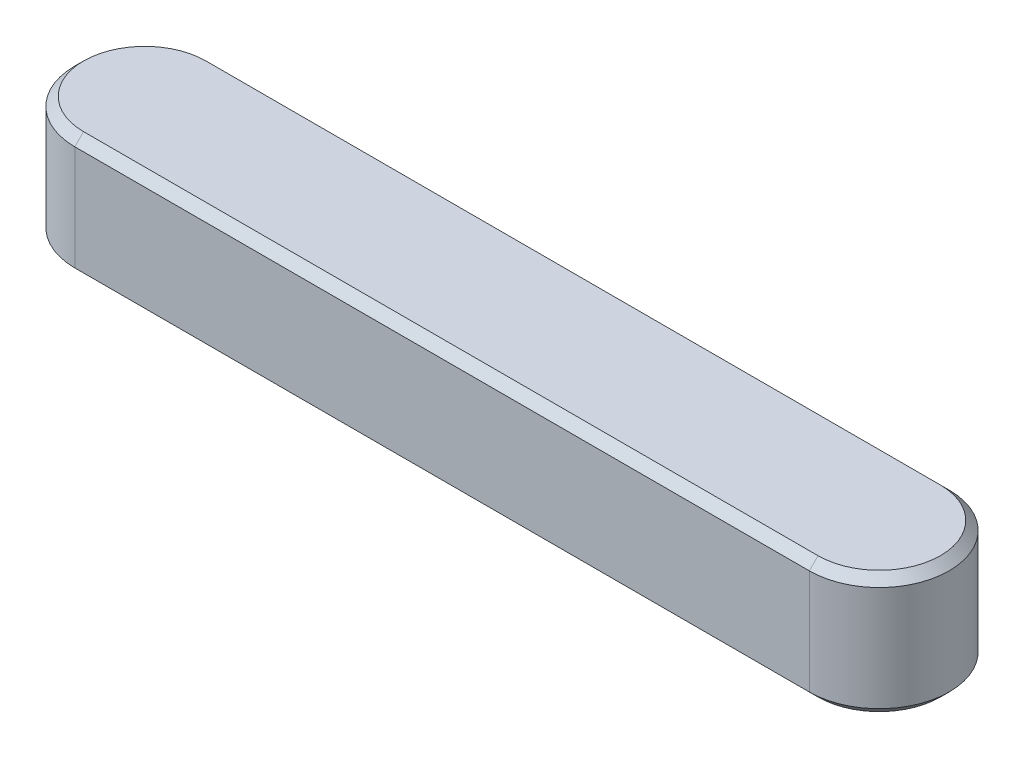
ISO-10303-21;
HEADER;
FILE_DESCRIPTION(('STEP AP214'),'2;1');
FILE_NAME('part.step','',(''),(''),'','','');
FILE_SCHEMA(('AUTOMOTIVE_DESIGN { 1 0 10303 214 1 1 1 1 }'));
ENDSEC;
DATA;
#1=APPLICATION_CONTEXT('core data for automotive mechanical design processes');
#2=APPLICATION_PROTOCOL_DEFINITION('international standard','automotive_design',2000,#1);
#3=PRODUCT_CONTEXT('',#1,'mechanical');
#4=PRODUCT('Part','Part','',(#3));
#5=PRODUCT_RELATED_PRODUCT_CATEGORY('part','',(#4));
#6=PRODUCT_DEFINITION_FORMATION('','',#4);
#7=PRODUCT_DEFINITION_CONTEXT('part definition',#1,'design');
#8=PRODUCT_DEFINITION('design','',#6,#7);
#9=PRODUCT_DEFINITION_SHAPE('','',#8);
#10=(LENGTH_UNIT() NAMED_UNIT(*) SI_UNIT(.MILLI.,.METRE.));
#11=(NAMED_UNIT(*) PLANE_ANGLE_UNIT() SI_UNIT($,.RADIAN.));
#12=(NAMED_UNIT(*) SI_UNIT($,.STERADIAN.) SOLID_ANGLE_UNIT());
#13=UNCERTAINTY_MEASURE_WITH_UNIT(LENGTH_MEASURE(1.E-05),#10,'distance_accuracy_value','');
#14=(GEOMETRIC_REPRESENTATION_CONTEXT(3) GLOBAL_UNCERTAINTY_ASSIGNED_CONTEXT((#13)) GLOBAL_UNIT_ASSIGNED_CONTEXT((#10,
#11,#12)) REPRESENTATION_CONTEXT('',''));
#15=CARTESIAN_POINT('',(0.,0.,0.));
#16=DIRECTION('',(0.,0.,1.));
#17=DIRECTION('',(1.,0.,0.));
#18=AXIS2_PLACEMENT_3D('',#15,#16,#17);
#19=CARTESIAN_POINT('',(-21.,7.,0.));
#20=DIRECTION('',(0.,-1.,0.));
#21=DIRECTION('',(0.,0.,-1.));
#22=AXIS2_PLACEMENT_3D('',#19,#20,#21);
#23=CYLINDRICAL_SURFACE('',#22,4.);
#24=DIRECTION('',(0.,-1.,0.));
#25=VECTOR('',#24,1.);
#26=CARTESIAN_POINT('',(-21.,7.,4.));
#27=LINE('',#26,#25);
#28=CARTESIAN_POINT('',(-21.,6.49999999999999,4.));
#29=VERTEX_POINT('',#28);
#30=CARTESIAN_POINT('',(-21.,0.49999999999999,4.));
#31=VERTEX_POINT('',#30);
#32=EDGE_CURVE('E127',#29,#31,#27,.T.);
#33=ORIENTED_EDGE('',*,*,#32,.F.);
#34=CARTESIAN_POINT('',(-21.,6.49999999999999,0.));
#35=DIRECTION('',(0.,1.,0.));
#36=DIRECTION('',(0.,0.,1.));
#37=AXIS2_PLACEMENT_3D('',#34,#35,#36);
#38=CIRCLE('',#37,4.);
#39=CARTESIAN_POINT('',(-21.,6.49999999999999,-4.));
#40=VERTEX_POINT('',#39);
#41=EDGE_CURVE('E151',#29,#40,#38,.F.);
#42=ORIENTED_EDGE('',*,*,#41,.T.);
#43=DIRECTION('',(0.,-1.,0.));
#44=VECTOR('',#43,1.);
#45=CARTESIAN_POINT('',(-21.,7.,-4.));
#46=LINE('',#45,#44);
#47=CARTESIAN_POINT('',(-21.,0.49999999999999,-4.));
#48=VERTEX_POINT('',#47);
#49=EDGE_CURVE('E162',#40,#48,#46,.T.);
#50=ORIENTED_EDGE('',*,*,#49,.T.);
#51=CARTESIAN_POINT('',(-21.,0.49999999999999,0.));
#52=DIRECTION('',(0.,1.,0.));
#53=DIRECTION('',(0.,0.,1.));
#54=AXIS2_PLACEMENT_3D('',#51,#52,#53);
#55=CIRCLE('',#54,4.);
#56=EDGE_CURVE('E149',#48,#31,#55,.T.);
#57=ORIENTED_EDGE('',*,*,#56,.T.);
#58=EDGE_LOOP('',(#33,#42,#50,#57));
#59=FACE_BOUND('',#58,.T.);
#60=ADVANCED_FACE('F41',(#59),#23,.T.);
#61=CARTESIAN_POINT('',(-21.,7.,4.));
#62=DIRECTION('',(0.,0.,-1.));
#63=DIRECTION('',(-1.,0.,0.));
#64=AXIS2_PLACEMENT_3D('',#61,#62,#63);
#65=PLANE('',#64);
#66=DIRECTION('',(0.,-1.,0.));
#67=VECTOR('',#66,1.);
#68=CARTESIAN_POINT('',(21.,7.,4.));
#69=LINE('',#68,#67);
#70=CARTESIAN_POINT('',(21.,6.49999999999999,4.));
#71=VERTEX_POINT('',#70);
#72=CARTESIAN_POINT('',(21.,0.49999999999999,4.));
#73=VERTEX_POINT('',#72);
#74=EDGE_CURVE('E314',#71,#73,#69,.T.);
#75=ORIENTED_EDGE('',*,*,#74,.F.);
#76=DIRECTION('',(-1.,0.,0.));
#77=VECTOR('',#76,1.);
#78=CARTESIAN_POINT('',(-21.,6.49999999999999,4.));
#79=LINE('',#78,#77);
#80=EDGE_CURVE('E147',#71,#29,#79,.T.);
#81=ORIENTED_EDGE('',*,*,#80,.T.);
#82=ORIENTED_EDGE('',*,*,#32,.T.);
#83=DIRECTION('',(1.,0.,0.));
#84=VECTOR('',#83,1.);
#85=CARTESIAN_POINT('',(-21.,0.49999999999999,4.));
#86=LINE('',#85,#84);
#87=EDGE_CURVE('E144',#31,#73,#86,.T.);
#88=ORIENTED_EDGE('',*,*,#87,.T.);
#89=EDGE_LOOP('',(#75,#81,#82,#88));
#90=FACE_BOUND('',#89,.T.);
#91=ADVANCED_FACE('F199',(#90),#65,.F.);
#92=CARTESIAN_POINT('',(21.,7.,0.));
#93=DIRECTION('',(0.,-1.,0.));
#94=DIRECTION('',(0.,0.,-1.));
#95=AXIS2_PLACEMENT_3D('',#92,#93,#94);
#96=CYLINDRICAL_SURFACE('',#95,4.);
#97=DIRECTION('',(0.,-1.,0.));
#98=VECTOR('',#97,1.);
#99=CARTESIAN_POINT('',(21.,7.,-4.00000000000001));
#100=LINE('',#99,#98);
#101=CARTESIAN_POINT('',(21.,6.49999999999999,-4.00000000000001));
#102=VERTEX_POINT('',#101);
#103=CARTESIAN_POINT('',(21.,0.49999999999999,-4.00000000000001));
#104=VERTEX_POINT('',#103);
#105=EDGE_CURVE('E310',#102,#104,#100,.T.);
#106=ORIENTED_EDGE('',*,*,#105,.F.);
#107=CARTESIAN_POINT('',(21.,6.49999999999999,0.));
#108=DIRECTION('',(0.,1.,0.));
#109=DIRECTION('',(0.,0.,1.));
#110=AXIS2_PLACEMENT_3D('',#107,#108,#109);
#111=CIRCLE('',#110,4.);
#112=EDGE_CURVE('E142',#102,#71,#111,.F.);
#113=ORIENTED_EDGE('',*,*,#112,.T.);
#114=ORIENTED_EDGE('',*,*,#74,.T.);
#115=CARTESIAN_POINT('',(21.,0.49999999999999,0.));
#116=DIRECTION('',(0.,1.,0.));
#117=DIRECTION('',(0.,0.,1.));
#118=AXIS2_PLACEMENT_3D('',#115,#116,#117);
#119=CIRCLE('',#118,4.);
#120=EDGE_CURVE('E140',#73,#104,#119,.T.);
#121=ORIENTED_EDGE('',*,*,#120,.T.);
#122=EDGE_LOOP('',(#106,#113,#114,#121));
#123=FACE_BOUND('',#122,.T.);
#124=ADVANCED_FACE('F205',(#123),#96,.T.);
#125=CARTESIAN_POINT('',(-21.,7.,-4.));
#126=DIRECTION('',(0.,0.,1.));
#127=DIRECTION('',(1.,0.,0.));
#128=AXIS2_PLACEMENT_3D('',#125,#126,#127);
#129=PLANE('',#128);
#130=ORIENTED_EDGE('',*,*,#49,.F.);
#131=DIRECTION('',(1.,0.,0.));
#132=VECTOR('',#131,1.);
#133=CARTESIAN_POINT('',(21.,6.49999999999999,-4.00000000000001));
#134=LINE('',#133,#132);
#135=EDGE_CURVE('E114',#40,#102,#134,.T.);
#136=ORIENTED_EDGE('',*,*,#135,.T.);
#137=ORIENTED_EDGE('',*,*,#105,.T.);
#138=DIRECTION('',(-1.,0.,0.));
#139=VECTOR('',#138,1.);
#140=CARTESIAN_POINT('',(-21.,0.49999999999999,-4.));
#141=LINE('',#140,#139);
#142=EDGE_CURVE('E133',#104,#48,#141,.T.);
#143=ORIENTED_EDGE('',*,*,#142,.T.);
#144=EDGE_LOOP('',(#130,#136,#137,#143));
#145=FACE_BOUND('',#144,.T.);
#146=ADVANCED_FACE('F195',(#145),#129,.F.);
#147=CARTESIAN_POINT('',(-21.,7.,0.));
#148=DIRECTION('',(0.,1.,0.));
#149=DIRECTION('',(0.,0.,1.));
#150=AXIS2_PLACEMENT_3D('',#147,#148,#149);
#151=PLANE('',#150);
#152=CARTESIAN_POINT('',(21.,7.,0.));
#153=DIRECTION('',(0.,1.,0.));
#154=DIRECTION('',(0.,0.,1.));
#155=AXIS2_PLACEMENT_3D('',#152,#153,#154);
#156=CIRCLE('',#155,3.5);
#157=CARTESIAN_POINT('',(21.,7.,3.49999999999999));
#158=VERTEX_POINT('',#157);
#159=CARTESIAN_POINT('',(21.,7.,-3.5));
#160=VERTEX_POINT('',#159);
#161=EDGE_CURVE('E131',#158,#160,#156,.T.);
#162=ORIENTED_EDGE('',*,*,#161,.T.);
#163=DIRECTION('',(-1.,0.,0.));
#164=VECTOR('',#163,1.);
#165=CARTESIAN_POINT('',(-21.,7.,-3.5));
#166=LINE('',#165,#164);
#167=CARTESIAN_POINT('',(-21.,7.,-3.49999999999999));
#168=VERTEX_POINT('',#167);
#169=EDGE_CURVE('E112',#160,#168,#166,.T.);
#170=ORIENTED_EDGE('',*,*,#169,.T.);
#171=CARTESIAN_POINT('',(-21.,7.,0.));
#172=DIRECTION('',(0.,1.,0.));
#173=DIRECTION('',(0.,0.,1.));
#174=AXIS2_PLACEMENT_3D('',#171,#172,#173);
#175=CIRCLE('',#174,3.5);
#176=CARTESIAN_POINT('',(-21.,7.,3.5));
#177=VERTEX_POINT('',#176);
#178=EDGE_CURVE('E120',#168,#177,#175,.T.);
#179=ORIENTED_EDGE('',*,*,#178,.T.);
#180=DIRECTION('',(1.,0.,0.));
#181=VECTOR('',#180,1.);
#182=CARTESIAN_POINT('',(21.,7.,3.49999999999999));
#183=LINE('',#182,#181);
#184=EDGE_CURVE('E126',#177,#158,#183,.T.);
#185=ORIENTED_EDGE('',*,*,#184,.T.);
#186=EDGE_LOOP('',(#162,#170,#179,#185));
#187=FACE_BOUND('',#186,.T.);
#188=ADVANCED_FACE('F129',(#187),#151,.T.);
#189=CARTESIAN_POINT('',(-21.,0.,0.));
#190=DIRECTION('',(0.,1.,0.));
#191=DIRECTION('',(0.,0.,1.));
#192=AXIS2_PLACEMENT_3D('',#189,#190,#191);
#193=PLANE('',#192);
#194=CARTESIAN_POINT('',(21.,0.,0.));
#195=DIRECTION('',(0.,1.,0.));
#196=DIRECTION('',(0.,0.,1.));
#197=AXIS2_PLACEMENT_3D('',#194,#195,#196);
#198=CIRCLE('',#197,3.5);
#199=CARTESIAN_POINT('',(21.,0.,-3.50000000000001));
#200=VERTEX_POINT('',#199);
#201=CARTESIAN_POINT('',(21.,0.,3.5));
#202=VERTEX_POINT('',#201);
#203=EDGE_CURVE('E51',#200,#202,#198,.F.);
#204=ORIENTED_EDGE('',*,*,#203,.T.);
#205=DIRECTION('',(-1.,0.,0.));
#206=VECTOR('',#205,1.);
#207=CARTESIAN_POINT('',(-21.,0.,3.5));
#208=LINE('',#207,#206);
#209=CARTESIAN_POINT('',(-21.,0.,3.50000000000001));
#210=VERTEX_POINT('',#209);
#211=EDGE_CURVE('E11',#202,#210,#208,.T.);
#212=ORIENTED_EDGE('',*,*,#211,.T.);
#213=CARTESIAN_POINT('',(-21.,0.,0.));
#214=DIRECTION('',(0.,1.,0.));
#215=DIRECTION('',(0.,0.,1.));
#216=AXIS2_PLACEMENT_3D('',#213,#214,#215);
#217=CIRCLE('',#216,3.5);
#218=CARTESIAN_POINT('',(-21.,0.,-3.5));
#219=VERTEX_POINT('',#218);
#220=EDGE_CURVE('E153',#210,#219,#217,.F.);
#221=ORIENTED_EDGE('',*,*,#220,.T.);
#222=DIRECTION('',(1.,0.,0.));
#223=VECTOR('',#222,1.);
#224=CARTESIAN_POINT('',(-21.,0.,-3.5));
#225=LINE('',#224,#223);
#226=EDGE_CURVE('E62',#219,#200,#225,.T.);
#227=ORIENTED_EDGE('',*,*,#226,.T.);
#228=EDGE_LOOP('',(#204,#212,#221,#227));
#229=FACE_BOUND('',#228,.T.);
#230=ADVANCED_FACE('F184',(#229),#193,.F.);
#231=CARTESIAN_POINT('',(-21.,7.,3.5));
#232=DIRECTION('',(0.,0.707106781186543,0.707106781186552));
#233=DIRECTION('',(-1.,0.,0.));
#234=AXIS2_PLACEMENT_3D('',#231,#232,#233);
#235=PLANE('',#234);
#236=DIRECTION('',(0.,0.707106781186552,-0.707106781186543));
#237=VECTOR('',#236,1.);
#238=CARTESIAN_POINT('',(-21.,6.49999999999999,4.));
#239=LINE('',#238,#237);
#240=EDGE_CURVE('E123',#29,#177,#239,.T.);
#241=ORIENTED_EDGE('',*,*,#240,.F.);
#242=ORIENTED_EDGE('',*,*,#80,.F.);
#243=DIRECTION('',(0.,-0.707106781186552,0.707106781186543));
#244=VECTOR('',#243,1.);
#245=CARTESIAN_POINT('',(21.,7.,3.49999999999999));
#246=LINE('',#245,#244);
#247=EDGE_CURVE('E159',#158,#71,#246,.T.);
#248=ORIENTED_EDGE('',*,*,#247,.F.);
#249=ORIENTED_EDGE('',*,*,#184,.F.);
#250=EDGE_LOOP('',(#241,#242,#248,#249));
#251=FACE_BOUND('',#250,.T.);
#252=ADVANCED_FACE('F186',(#251),#235,.T.);
#253=CARTESIAN_POINT('',(21.,7.,0.));
#254=DIRECTION('',(0.,-1.,0.));
#255=DIRECTION('',(0.,0.,-1.));
#256=AXIS2_PLACEMENT_3D('',#253,#254,#255);
#257=CONICAL_SURFACE('',#256,3.5,0.785398163397441);
#258=ORIENTED_EDGE('',*,*,#247,.T.);
#259=ORIENTED_EDGE('',*,*,#112,.F.);
#260=DIRECTION('',(0.,-0.707106781186552,-0.707106781186543));
#261=VECTOR('',#260,1.);
#262=CARTESIAN_POINT('',(21.,7.,-3.5));
#263=LINE('',#262,#261);
#264=EDGE_CURVE('E117',#160,#102,#263,.T.);
#265=ORIENTED_EDGE('',*,*,#264,.F.);
#266=ORIENTED_EDGE('',*,*,#161,.F.);
#267=EDGE_LOOP('',(#258,#259,#265,#266));
#268=FACE_BOUND('',#267,.T.);
#269=ADVANCED_FACE('F192',(#268),#257,.T.);
#270=CARTESIAN_POINT('',(-21.,7.,0.));
#271=DIRECTION('',(0.,-1.,0.));
#272=DIRECTION('',(0.,0.,-1.));
#273=AXIS2_PLACEMENT_3D('',#270,#271,#272);
#274=CONICAL_SURFACE('',#273,3.5,0.785398163397441);
#275=ORIENTED_EDGE('',*,*,#240,.T.);
#276=ORIENTED_EDGE('',*,*,#178,.F.);
#277=DIRECTION('',(0.,0.707106781186552,0.707106781186543));
#278=VECTOR('',#277,1.);
#279=CARTESIAN_POINT('',(-21.,6.49999999999999,-3.99999999999999));
#280=LINE('',#279,#278);
#281=EDGE_CURVE('E108',#40,#168,#280,.T.);
#282=ORIENTED_EDGE('',*,*,#281,.F.);
#283=ORIENTED_EDGE('',*,*,#41,.F.);
#284=EDGE_LOOP('',(#275,#276,#282,#283));
#285=FACE_BOUND('',#284,.T.);
#286=ADVANCED_FACE('F121',(#285),#274,.T.);
#287=CARTESIAN_POINT('',(-21.,7.,-3.5));
#288=DIRECTION('',(0.,0.707106781186543,-0.707106781186552));
#289=DIRECTION('',(1.,0.,0.));
#290=AXIS2_PLACEMENT_3D('',#287,#288,#289);
#291=PLANE('',#290);
#292=ORIENTED_EDGE('',*,*,#264,.T.);
#293=ORIENTED_EDGE('',*,*,#135,.F.);
#294=ORIENTED_EDGE('',*,*,#281,.T.);
#295=ORIENTED_EDGE('',*,*,#169,.F.);
#296=EDGE_LOOP('',(#292,#293,#294,#295));
#297=FACE_BOUND('',#296,.T.);
#298=ADVANCED_FACE('F110',(#297),#291,.T.);
#299=CARTESIAN_POINT('',(-21.,0.49999999999999,-4.));
#300=DIRECTION('',(0.,0.707106781186552,0.707106781186543));
#301=DIRECTION('',(-1.,0.,0.));
#302=AXIS2_PLACEMENT_3D('',#299,#300,#301);
#303=PLANE('',#302);
#304=DIRECTION('',(0.,0.707106781186543,-0.707106781186552));
#305=VECTOR('',#304,1.);
#306=CARTESIAN_POINT('',(21.,0.,-3.50000000000001));
#307=LINE('',#306,#305);
#308=EDGE_CURVE('E166',#200,#104,#307,.T.);
#309=ORIENTED_EDGE('',*,*,#308,.F.);
#310=ORIENTED_EDGE('',*,*,#226,.F.);
#311=DIRECTION('',(0.,-0.707106781186543,0.707106781186552));
#312=VECTOR('',#311,1.);
#313=CARTESIAN_POINT('',(-21.,0.49999999999999,-4.));
#314=LINE('',#313,#312);
#315=EDGE_CURVE('E46',#48,#219,#314,.T.);
#316=ORIENTED_EDGE('',*,*,#315,.F.);
#317=ORIENTED_EDGE('',*,*,#142,.F.);
#318=EDGE_LOOP('',(#309,#310,#316,#317));
#319=FACE_BOUND('',#318,.T.);
#320=ADVANCED_FACE('F44',(#319),#303,.F.);
#321=CARTESIAN_POINT('',(-21.,0.49999999999999,0.));
#322=DIRECTION('',(0.,1.,0.));
#323=DIRECTION('',(0.,0.,1.));
#324=AXIS2_PLACEMENT_3D('',#321,#322,#323);
#325=CONICAL_SURFACE('',#324,4.,0.785398163397455);
#326=ORIENTED_EDGE('',*,*,#315,.T.);
#327=ORIENTED_EDGE('',*,*,#220,.F.);
#328=DIRECTION('',(0.,-0.707106781186543,-0.707106781186552));
#329=VECTOR('',#328,1.);
#330=CARTESIAN_POINT('',(-21.,0.49999999999999,4.00000000000001));
#331=LINE('',#330,#329);
#332=EDGE_CURVE('E165',#31,#210,#331,.T.);
#333=ORIENTED_EDGE('',*,*,#332,.F.);
#334=ORIENTED_EDGE('',*,*,#56,.F.);
#335=EDGE_LOOP('',(#326,#327,#333,#334));
#336=FACE_BOUND('',#335,.T.);
#337=ADVANCED_FACE('F175',(#336),#325,.T.);
#338=CARTESIAN_POINT('',(21.,0.49999999999999,0.));
#339=DIRECTION('',(0.,1.,0.));
#340=DIRECTION('',(0.,0.,1.));
#341=AXIS2_PLACEMENT_3D('',#338,#339,#340);
#342=CONICAL_SURFACE('',#341,4.,0.785398163397455);
#343=ORIENTED_EDGE('',*,*,#308,.T.);
#344=ORIENTED_EDGE('',*,*,#120,.F.);
#345=DIRECTION('',(0.,0.707106781186543,0.707106781186552));
#346=VECTOR('',#345,1.);
#347=CARTESIAN_POINT('',(21.,0.,3.5));
#348=LINE('',#347,#346);
#349=EDGE_CURVE('E163',#202,#73,#348,.T.);
#350=ORIENTED_EDGE('',*,*,#349,.F.);
#351=ORIENTED_EDGE('',*,*,#203,.F.);
#352=EDGE_LOOP('',(#343,#344,#350,#351));
#353=FACE_BOUND('',#352,.T.);
#354=ADVANCED_FACE('F180',(#353),#342,.T.);
#355=CARTESIAN_POINT('',(-21.,0.49999999999999,4.));
#356=DIRECTION('',(0.,0.707106781186552,-0.707106781186543));
#357=DIRECTION('',(1.,0.,0.));
#358=AXIS2_PLACEMENT_3D('',#355,#356,#357);
#359=PLANE('',#358);
#360=ORIENTED_EDGE('',*,*,#332,.T.);
#361=ORIENTED_EDGE('',*,*,#211,.F.);
#362=ORIENTED_EDGE('',*,*,#349,.T.);
#363=ORIENTED_EDGE('',*,*,#87,.F.);
#364=EDGE_LOOP('',(#360,#361,#362,#363));
#365=FACE_BOUND('',#364,.T.);
#366=ADVANCED_FACE('F183',(#365),#359,.F.);
#367=CLOSED_SHELL('',(#60,#91,#124,#146,#188,#230,#252,#269,#286,#298,#320,#337,#354,#366));
#368=MANIFOLD_SOLID_BREP('B2',#367);
#369=ADVANCED_BREP_SHAPE_REPRESENTATION('',(#18,#368),#14);
#370=SHAPE_DEFINITION_REPRESENTATION(#9,#369);
ENDSEC;
END-ISO-10303-21;
